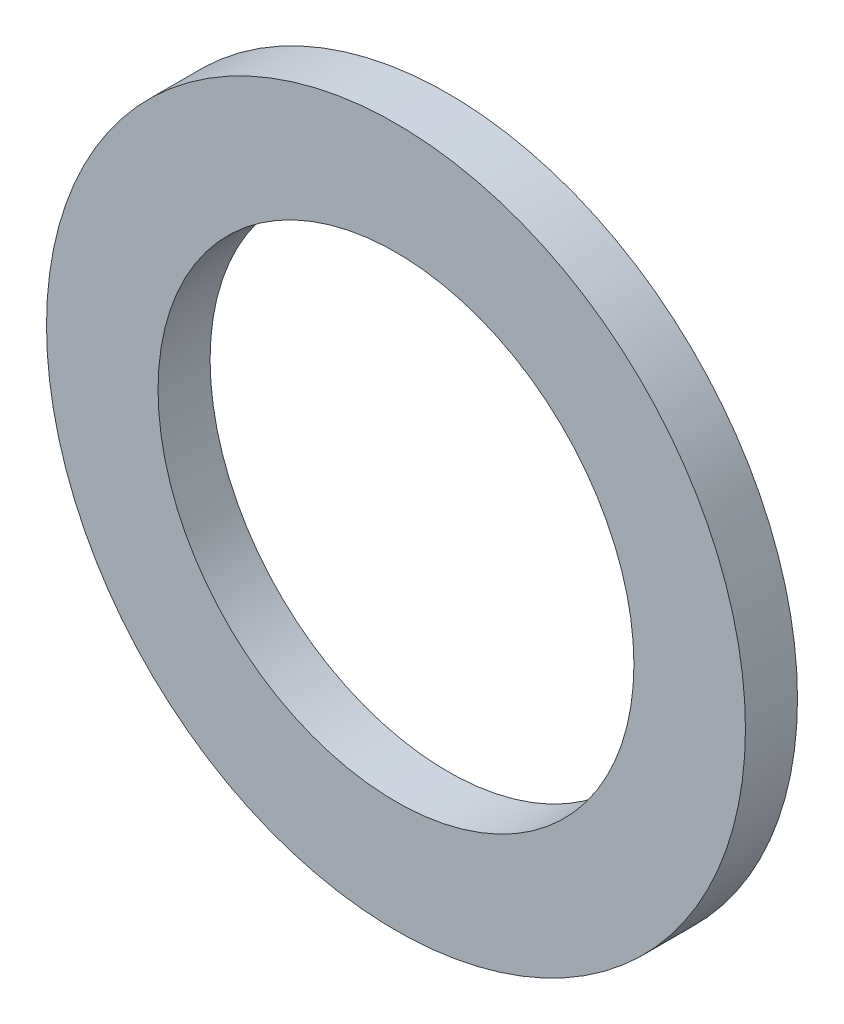
ISO-10303-21;
HEADER;
FILE_DESCRIPTION(('STEP AP214'),'2;1');
FILE_NAME('part.step','',(''),(''),'','','');
FILE_SCHEMA(('AUTOMOTIVE_DESIGN { 1 0 10303 214 1 1 1 1 }'));
ENDSEC;
DATA;
#1=APPLICATION_CONTEXT('core data for automotive mechanical design processes');
#2=APPLICATION_PROTOCOL_DEFINITION('international standard','automotive_design',2000,#1);
#3=PRODUCT_CONTEXT('',#1,'mechanical');
#4=PRODUCT('Part','Part','',(#3));
#5=PRODUCT_RELATED_PRODUCT_CATEGORY('part','',(#4));
#6=PRODUCT_DEFINITION_FORMATION('','',#4);
#7=PRODUCT_DEFINITION_CONTEXT('part definition',#1,'design');
#8=PRODUCT_DEFINITION('design','',#6,#7);
#9=PRODUCT_DEFINITION_SHAPE('','',#8);
#10=(LENGTH_UNIT() NAMED_UNIT(*) SI_UNIT(.MILLI.,.METRE.));
#11=(NAMED_UNIT(*) PLANE_ANGLE_UNIT() SI_UNIT($,.RADIAN.));
#12=(NAMED_UNIT(*) SI_UNIT($,.STERADIAN.) SOLID_ANGLE_UNIT());
#13=UNCERTAINTY_MEASURE_WITH_UNIT(LENGTH_MEASURE(1.E-05),#10,'distance_accuracy_value','');
#14=(GEOMETRIC_REPRESENTATION_CONTEXT(3) GLOBAL_UNCERTAINTY_ASSIGNED_CONTEXT((#13)) GLOBAL_UNIT_ASSIGNED_CONTEXT((#10,
#11,#12)) REPRESENTATION_CONTEXT('',''));
#15=CARTESIAN_POINT('',(0.,0.,0.));
#16=DIRECTION('',(0.,0.,1.));
#17=DIRECTION('',(1.,0.,0.));
#18=AXIS2_PLACEMENT_3D('',#15,#16,#17);
#19=CARTESIAN_POINT('',(0.,0.,-1.));
#20=DIRECTION('',(0.,0.,-1.));
#21=DIRECTION('',(1.,0.,0.));
#22=AXIS2_PLACEMENT_3D('',#19,#20,#21);
#23=CYLINDRICAL_SURFACE('',#22,16.);
#24=CARTESIAN_POINT('',(0.,0.,0.));
#25=DIRECTION('',(0.,0.,-1.));
#26=DIRECTION('',(1.,0.,0.));
#27=AXIS2_PLACEMENT_3D('',#24,#25,#26);
#28=CIRCLE('',#27,16.);
#29=CARTESIAN_POINT('',(16.,0.,0.));
#30=VERTEX_POINT('',#29);
#31=EDGE_CURVE('E59',#30,#30,#28,.T.);
#32=ORIENTED_EDGE('',*,*,#31,.T.);
#33=DIRECTION('',(0.,0.,1.));
#34=VECTOR('',#33,1.);
#35=CARTESIAN_POINT('',(16.,0.,-1.));
#36=LINE('',#35,#34);
#37=CARTESIAN_POINT('',(16.,0.,3.5));
#38=VERTEX_POINT('',#37);
#39=EDGE_CURVE('E9',#30,#38,#36,.T.);
#40=ORIENTED_EDGE('',*,*,#39,.T.);
#41=CARTESIAN_POINT('',(0.,0.,3.5));
#42=DIRECTION('',(0.,0.,-1.));
#43=DIRECTION('',(1.,0.,0.));
#44=AXIS2_PLACEMENT_3D('',#41,#42,#43);
#45=CIRCLE('',#44,16.);
#46=EDGE_CURVE('E24',#38,#38,#45,.T.);
#47=ORIENTED_EDGE('',*,*,#46,.F.);
#48=ORIENTED_EDGE('',*,*,#39,.F.);
#49=EDGE_LOOP('',(#32,#40,#47,#48));
#50=FACE_BOUND('',#49,.T.);
#51=ADVANCED_FACE('F15',(#50),#23,.F.);
#52=CARTESIAN_POINT('',(0.,0.,3.5));
#53=DIRECTION('',(0.,0.,1.));
#54=DIRECTION('',(1.,0.,0.));
#55=AXIS2_PLACEMENT_3D('',#52,#53,#54);
#56=PLANE('',#55);
#57=ORIENTED_EDGE('',*,*,#46,.T.);
#58=EDGE_LOOP('',(#57));
#59=FACE_BOUND('',#58,.T.);
#60=CARTESIAN_POINT('',(0.,0.,3.5));
#61=DIRECTION('',(0.,0.,1.));
#62=DIRECTION('',(1.,0.,0.));
#63=AXIS2_PLACEMENT_3D('',#60,#61,#62);
#64=CIRCLE('',#63,23.5);
#65=CARTESIAN_POINT('',(23.5,0.,3.5));
#66=VERTEX_POINT('',#65);
#67=EDGE_CURVE('E55',#66,#66,#64,.T.);
#68=ORIENTED_EDGE('',*,*,#67,.T.);
#69=EDGE_LOOP('',(#68));
#70=FACE_BOUND('',#69,.T.);
#71=ADVANCED_FACE('F67',(#59,#70),#56,.T.);
#72=CARTESIAN_POINT('',(0.,0.,0.));
#73=DIRECTION('',(0.,0.,1.));
#74=DIRECTION('',(1.,0.,0.));
#75=AXIS2_PLACEMENT_3D('',#72,#73,#74);
#76=PLANE('',#75);
#77=ORIENTED_EDGE('',*,*,#31,.F.);
#78=EDGE_LOOP('',(#77));
#79=FACE_BOUND('',#78,.T.);
#80=CARTESIAN_POINT('',(0.,0.,0.));
#81=DIRECTION('',(0.,0.,1.));
#82=DIRECTION('',(1.,0.,0.));
#83=AXIS2_PLACEMENT_3D('',#80,#81,#82);
#84=CIRCLE('',#83,23.5);
#85=CARTESIAN_POINT('',(23.5,0.,0.));
#86=VERTEX_POINT('',#85);
#87=EDGE_CURVE('E51',#86,#86,#84,.T.);
#88=ORIENTED_EDGE('',*,*,#87,.F.);
#89=EDGE_LOOP('',(#88));
#90=FACE_BOUND('',#89,.T.);
#91=ADVANCED_FACE('F68',(#79,#90),#76,.F.);
#92=CARTESIAN_POINT('',(0.,0.,0.));
#93=DIRECTION('',(0.,0.,-1.));
#94=DIRECTION('',(1.,0.,0.));
#95=AXIS2_PLACEMENT_3D('',#92,#93,#94);
#96=CYLINDRICAL_SURFACE('',#95,23.5);
#97=ORIENTED_EDGE('',*,*,#87,.T.);
#98=DIRECTION('',(0.,0.,1.));
#99=VECTOR('',#98,1.);
#100=CARTESIAN_POINT('',(23.5,0.,0.));
#101=LINE('',#100,#99);
#102=EDGE_CURVE('E48',#86,#66,#101,.T.);
#103=ORIENTED_EDGE('',*,*,#102,.T.);
#104=ORIENTED_EDGE('',*,*,#67,.F.);
#105=ORIENTED_EDGE('',*,*,#102,.F.);
#106=EDGE_LOOP('',(#97,#103,#104,#105));
#107=FACE_BOUND('',#106,.T.);
#108=ADVANCED_FACE('F47',(#107),#96,.T.);
#109=CLOSED_SHELL('',(#51,#71,#91,#108));
#110=MANIFOLD_SOLID_BREP('B1',#109);
#111=ADVANCED_BREP_SHAPE_REPRESENTATION('',(#18,#110),#14);
#112=SHAPE_DEFINITION_REPRESENTATION(#9,#111);
ENDSEC;
END-ISO-10303-21;
